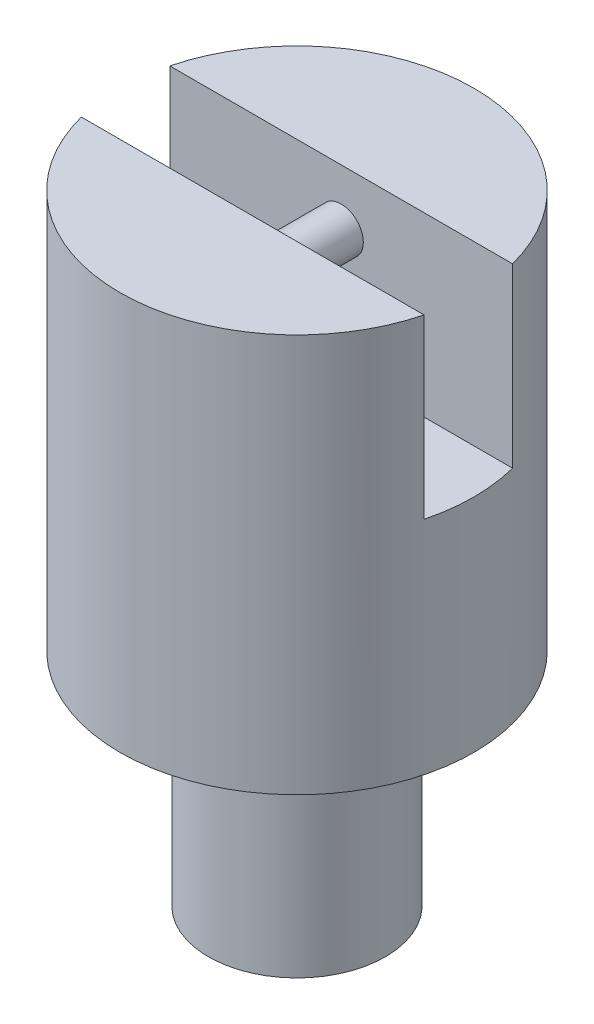
ISO-10303-21;
HEADER;
FILE_DESCRIPTION(('STEP AP214'),'2;1');
FILE_NAME('part.step','',(''),(''),'','','');
FILE_SCHEMA(('AUTOMOTIVE_DESIGN { 1 0 10303 214 1 1 1 1 }'));
ENDSEC;
DATA;
#1=APPLICATION_CONTEXT('core data for automotive mechanical design processes');
#2=APPLICATION_PROTOCOL_DEFINITION('international standard','automotive_design',2000,#1);
#3=PRODUCT_CONTEXT('',#1,'mechanical');
#4=PRODUCT('Part','Part','',(#3));
#5=PRODUCT_RELATED_PRODUCT_CATEGORY('part','',(#4));
#6=PRODUCT_DEFINITION_FORMATION('','',#4);
#7=PRODUCT_DEFINITION_CONTEXT('part definition',#1,'design');
#8=PRODUCT_DEFINITION('design','',#6,#7);
#9=PRODUCT_DEFINITION_SHAPE('','',#8);
#10=(LENGTH_UNIT() NAMED_UNIT(*) SI_UNIT(.MILLI.,.METRE.));
#11=(NAMED_UNIT(*) PLANE_ANGLE_UNIT() SI_UNIT($,.RADIAN.));
#12=(NAMED_UNIT(*) SI_UNIT($,.STERADIAN.) SOLID_ANGLE_UNIT());
#13=UNCERTAINTY_MEASURE_WITH_UNIT(LENGTH_MEASURE(1.E-05),#10,'distance_accuracy_value','');
#14=(GEOMETRIC_REPRESENTATION_CONTEXT(3) GLOBAL_UNCERTAINTY_ASSIGNED_CONTEXT((#13)) GLOBAL_UNIT_ASSIGNED_CONTEXT((#10,
#11,#12)) REPRESENTATION_CONTEXT('',''));
#15=CARTESIAN_POINT('',(0.,0.,0.));
#16=DIRECTION('',(0.,0.,1.));
#17=DIRECTION('',(1.,0.,0.));
#18=AXIS2_PLACEMENT_3D('',#15,#16,#17);
#19=CARTESIAN_POINT('',(0.,0.,0.));
#20=DIRECTION('',(0.,1.,0.));
#21=DIRECTION('',(0.,0.,1.));
#22=AXIS2_PLACEMENT_3D('',#19,#20,#21);
#23=PLANE('',#22);
#24=DIRECTION('',(1.,0.,0.));
#25=VECTOR('',#24,1.);
#26=CARTESIAN_POINT('',(0.,0.,12.7));
#27=LINE('',#26,#25);
#28=CARTESIAN_POINT('',(-49.1868884968342,0.,12.7));
#29=VERTEX_POINT('',#28);
#30=CARTESIAN_POINT('',(49.1868884968342,0.,12.7));
#31=VERTEX_POINT('',#30);
#32=EDGE_CURVE('E95',#29,#31,#27,.T.);
#33=ORIENTED_EDGE('',*,*,#32,.F.);
#34=CARTESIAN_POINT('',(0.,0.,0.));
#35=DIRECTION('',(0.,1.,0.));
#36=DIRECTION('',(0.,0.,1.));
#37=AXIS2_PLACEMENT_3D('',#34,#35,#36);
#38=CIRCLE('',#37,50.8);
#39=EDGE_CURVE('E110',#29,#31,#38,.T.);
#40=ORIENTED_EDGE('',*,*,#39,.T.);
#41=EDGE_LOOP('',(#33,#40));
#42=FACE_BOUND('',#41,.T.);
#43=ADVANCED_FACE('F45',(#42),#23,.T.);
#44=CARTESIAN_POINT('',(0.,-114.3,0.));
#45=DIRECTION('',(0.,1.,0.));
#46=DIRECTION('',(0.,0.,1.));
#47=AXIS2_PLACEMENT_3D('',#44,#45,#46);
#48=CYLINDRICAL_SURFACE('',#47,50.8);
#49=DIRECTION('',(0.,1.,0.));
#50=VECTOR('',#49,1.);
#51=CARTESIAN_POINT('',(-49.1868884968342,-114.3,12.7));
#52=LINE('',#51,#50);
#53=CARTESIAN_POINT('',(-49.1868884968342,-50.8,12.7));
#54=VERTEX_POINT('',#53);
#55=EDGE_CURVE('E105',#54,#29,#52,.T.);
#56=ORIENTED_EDGE('',*,*,#55,.F.);
#57=CARTESIAN_POINT('',(0.,-50.8,0.));
#58=DIRECTION('',(0.,-1.,0.));
#59=DIRECTION('',(0.,0.,-1.));
#60=AXIS2_PLACEMENT_3D('',#57,#58,#59);
#61=CIRCLE('',#60,50.8);
#62=CARTESIAN_POINT('',(-49.1868884968342,-50.8,-12.7));
#63=VERTEX_POINT('',#62);
#64=EDGE_CURVE('E103',#63,#54,#61,.F.);
#65=ORIENTED_EDGE('',*,*,#64,.F.);
#66=DIRECTION('',(0.,1.,0.));
#67=VECTOR('',#66,1.);
#68=CARTESIAN_POINT('',(-49.1868884968342,-114.3,-12.7));
#69=LINE('',#68,#67);
#70=CARTESIAN_POINT('',(-49.1868884968342,0.,-12.7));
#71=VERTEX_POINT('',#70);
#72=EDGE_CURVE('E89',#71,#63,#69,.F.);
#73=ORIENTED_EDGE('',*,*,#72,.F.);
#74=CARTESIAN_POINT('',(49.1868884968342,0.,-12.7));
#75=VERTEX_POINT('',#74);
#76=EDGE_CURVE('E102',#75,#71,#38,.T.);
#77=ORIENTED_EDGE('',*,*,#76,.F.);
#78=DIRECTION('',(0.,1.,0.));
#79=VECTOR('',#78,1.);
#80=CARTESIAN_POINT('',(49.1868884968342,-114.3,-12.7));
#81=LINE('',#80,#79);
#82=CARTESIAN_POINT('',(49.1868884968342,-50.8,-12.7));
#83=VERTEX_POINT('',#82);
#84=EDGE_CURVE('E61',#83,#75,#81,.T.);
#85=ORIENTED_EDGE('',*,*,#84,.F.);
#86=CARTESIAN_POINT('',(49.1868884968342,-50.8,12.7));
#87=VERTEX_POINT('',#86);
#88=EDGE_CURVE('E122',#87,#83,#61,.F.);
#89=ORIENTED_EDGE('',*,*,#88,.F.);
#90=DIRECTION('',(0.,1.,0.));
#91=VECTOR('',#90,1.);
#92=CARTESIAN_POINT('',(49.1868884968342,-114.3,12.7));
#93=LINE('',#92,#91);
#94=EDGE_CURVE('E69',#31,#87,#93,.F.);
#95=ORIENTED_EDGE('',*,*,#94,.F.);
#96=ORIENTED_EDGE('',*,*,#39,.F.);
#97=EDGE_LOOP('',(#56,#65,#73,#77,#85,#89,#95,#96));
#98=FACE_BOUND('',#97,.T.);
#99=CARTESIAN_POINT('',(0.,-114.3,0.));
#100=DIRECTION('',(0.,1.,0.));
#101=DIRECTION('',(0.,0.,1.));
#102=AXIS2_PLACEMENT_3D('',#99,#100,#101);
#103=CIRCLE('',#102,50.8);
#104=CARTESIAN_POINT('',(0.,-114.3,50.8));
#105=VERTEX_POINT('',#104);
#106=EDGE_CURVE('E109',#105,#105,#103,.T.);
#107=ORIENTED_EDGE('',*,*,#106,.T.);
#108=EDGE_LOOP('',(#107));
#109=FACE_BOUND('',#108,.T.);
#110=ADVANCED_FACE('F47',(#98,#109),#48,.T.);
#111=CARTESIAN_POINT('',(0.,-114.3,0.));
#112=DIRECTION('',(0.,1.,0.));
#113=DIRECTION('',(0.,0.,1.));
#114=AXIS2_PLACEMENT_3D('',#111,#112,#113);
#115=PLANE('',#114);
#116=CARTESIAN_POINT('',(0.,-114.3,0.));
#117=DIRECTION('',(0.,-1.,0.));
#118=DIRECTION('',(0.,0.,-1.));
#119=AXIS2_PLACEMENT_3D('',#116,#117,#118);
#120=CIRCLE('',#119,25.4);
#121=CARTESIAN_POINT('',(0.,-114.3,-25.4));
#122=VERTEX_POINT('',#121);
#123=EDGE_CURVE('E96',#122,#122,#120,.T.);
#124=ORIENTED_EDGE('',*,*,#123,.F.);
#125=EDGE_LOOP('',(#124));
#126=FACE_BOUND('',#125,.T.);
#127=ORIENTED_EDGE('',*,*,#106,.F.);
#128=EDGE_LOOP('',(#127));
#129=FACE_BOUND('',#128,.T.);
#130=ADVANCED_FACE('F153',(#126,#129),#115,.F.);
#131=DIRECTION('',(-1.,0.,0.));
#132=VECTOR('',#131,1.);
#133=CARTESIAN_POINT('',(0.,0.,-12.7));
#134=LINE('',#133,#132);
#135=EDGE_CURVE('E86',#75,#71,#134,.T.);
#136=ORIENTED_EDGE('',*,*,#135,.F.);
#137=ORIENTED_EDGE('',*,*,#76,.T.);
#138=EDGE_LOOP('',(#136,#137));
#139=FACE_BOUND('',#138,.T.);
#140=ADVANCED_FACE('F107',(#139),#23,.T.);
#141=CARTESIAN_POINT('',(0.,-177.8,0.));
#142=DIRECTION('',(0.,1.,0.));
#143=DIRECTION('',(0.,0.,1.));
#144=AXIS2_PLACEMENT_3D('',#141,#142,#143);
#145=CYLINDRICAL_SURFACE('',#144,25.4);
#146=CARTESIAN_POINT('',(0.,-177.8,0.));
#147=DIRECTION('',(0.,-1.,0.));
#148=DIRECTION('',(0.,0.,-1.));
#149=AXIS2_PLACEMENT_3D('',#146,#147,#148);
#150=CIRCLE('',#149,25.4);
#151=CARTESIAN_POINT('',(0.,-177.8,-25.4));
#152=VERTEX_POINT('',#151);
#153=EDGE_CURVE('E117',#152,#152,#150,.T.);
#154=ORIENTED_EDGE('',*,*,#153,.F.);
#155=EDGE_LOOP('',(#154));
#156=FACE_BOUND('',#155,.T.);
#157=ORIENTED_EDGE('',*,*,#123,.T.);
#158=EDGE_LOOP('',(#157));
#159=FACE_BOUND('',#158,.T.);
#160=ADVANCED_FACE('F151',(#156,#159),#145,.T.);
#161=CARTESIAN_POINT('',(0.,-177.8,0.));
#162=DIRECTION('',(0.,-1.,0.));
#163=DIRECTION('',(0.,0.,-1.));
#164=AXIS2_PLACEMENT_3D('',#161,#162,#163);
#165=PLANE('',#164);
#166=ORIENTED_EDGE('',*,*,#153,.T.);
#167=EDGE_LOOP('',(#166));
#168=FACE_BOUND('',#167,.T.);
#169=ADVANCED_FACE('F171',(#168),#165,.T.);
#170=CARTESIAN_POINT('',(-65.3234160013123,-50.8,12.7));
#171=DIRECTION('',(0.,0.,1.));
#172=DIRECTION('',(1.,0.,0.));
#173=AXIS2_PLACEMENT_3D('',#170,#171,#172);
#174=PLANE('',#173);
#175=CARTESIAN_POINT('',(0.,-16.0759279572053,12.7));
#176=DIRECTION('',(0.,0.,1.));
#177=DIRECTION('',(1.,0.,0.));
#178=AXIS2_PLACEMENT_3D('',#175,#176,#177);
#179=CIRCLE('',#178,6.35);
#180=CARTESIAN_POINT('',(6.35,-16.0759279572053,12.7));
#181=VERTEX_POINT('',#180);
#182=EDGE_CURVE('E11',#181,#181,#179,.F.);
#183=ORIENTED_EDGE('',*,*,#182,.F.);
#184=EDGE_LOOP('',(#183));
#185=FACE_BOUND('',#184,.T.);
#186=ORIENTED_EDGE('',*,*,#94,.T.);
#187=DIRECTION('',(1.,0.,0.));
#188=VECTOR('',#187,1.);
#189=CARTESIAN_POINT('',(-65.3234160013123,-50.8,12.7));
#190=LINE('',#189,#188);
#191=EDGE_CURVE('E131',#54,#87,#190,.T.);
#192=ORIENTED_EDGE('',*,*,#191,.F.);
#193=ORIENTED_EDGE('',*,*,#55,.T.);
#194=ORIENTED_EDGE('',*,*,#32,.T.);
#195=EDGE_LOOP('',(#186,#192,#193,#194));
#196=FACE_BOUND('',#195,.T.);
#197=ADVANCED_FACE('F134',(#185,#196),#174,.F.);
#198=CARTESIAN_POINT('',(-65.3234160013123,-50.8,-12.7));
#199=DIRECTION('',(0.,0.,-1.));
#200=DIRECTION('',(-1.,0.,0.));
#201=AXIS2_PLACEMENT_3D('',#198,#199,#200);
#202=PLANE('',#201);
#203=CARTESIAN_POINT('',(0.,-16.0759279572053,-12.7));
#204=DIRECTION('',(0.,0.,-1.));
#205=DIRECTION('',(-1.,0.,0.));
#206=AXIS2_PLACEMENT_3D('',#203,#204,#205);
#207=CIRCLE('',#206,6.35);
#208=CARTESIAN_POINT('',(-6.35,-16.0759279572053,-12.7));
#209=VERTEX_POINT('',#208);
#210=EDGE_CURVE('E54',#209,#209,#207,.F.);
#211=ORIENTED_EDGE('',*,*,#210,.F.);
#212=EDGE_LOOP('',(#211));
#213=FACE_BOUND('',#212,.T.);
#214=ORIENTED_EDGE('',*,*,#72,.T.);
#215=DIRECTION('',(-1.,0.,0.));
#216=VECTOR('',#215,1.);
#217=CARTESIAN_POINT('',(-65.3234160013123,-50.8,-12.7));
#218=LINE('',#217,#216);
#219=EDGE_CURVE('E133',#83,#63,#218,.T.);
#220=ORIENTED_EDGE('',*,*,#219,.F.);
#221=ORIENTED_EDGE('',*,*,#84,.T.);
#222=ORIENTED_EDGE('',*,*,#135,.T.);
#223=EDGE_LOOP('',(#214,#220,#221,#222));
#224=FACE_BOUND('',#223,.T.);
#225=ADVANCED_FACE('F88',(#213,#224),#202,.F.);
#226=CARTESIAN_POINT('',(0.,-50.8,0.));
#227=DIRECTION('',(0.,-1.,0.));
#228=DIRECTION('',(0.,0.,-1.));
#229=AXIS2_PLACEMENT_3D('',#226,#227,#228);
#230=PLANE('',#229);
#231=ORIENTED_EDGE('',*,*,#64,.T.);
#232=ORIENTED_EDGE('',*,*,#191,.T.);
#233=ORIENTED_EDGE('',*,*,#88,.T.);
#234=ORIENTED_EDGE('',*,*,#219,.T.);
#235=EDGE_LOOP('',(#231,#232,#233,#234));
#236=FACE_BOUND('',#235,.T.);
#237=ADVANCED_FACE('F130',(#236),#230,.F.);
#238=CARTESIAN_POINT('',(0.,-16.0759279572053,-38.1));
#239=DIRECTION('',(0.,0.,1.));
#240=DIRECTION('',(1.,0.,0.));
#241=AXIS2_PLACEMENT_3D('',#238,#239,#240);
#242=CYLINDRICAL_SURFACE('',#241,6.35);
#243=ORIENTED_EDGE('',*,*,#182,.T.);
#244=EDGE_LOOP('',(#243));
#245=FACE_BOUND('',#244,.T.);
#246=ORIENTED_EDGE('',*,*,#210,.T.);
#247=EDGE_LOOP('',(#246));
#248=FACE_BOUND('',#247,.T.);
#249=ADVANCED_FACE('F187',(#245,#248),#242,.T.);
#250=CLOSED_SHELL('',(#43,#110,#130,#140,#160,#169,#197,#225,#237,#249));
#251=MANIFOLD_SOLID_BREP('B2',#250);
#252=ADVANCED_BREP_SHAPE_REPRESENTATION('',(#18,#251),#14);
#253=SHAPE_DEFINITION_REPRESENTATION(#9,#252);
ENDSEC;
END-ISO-10303-21;
